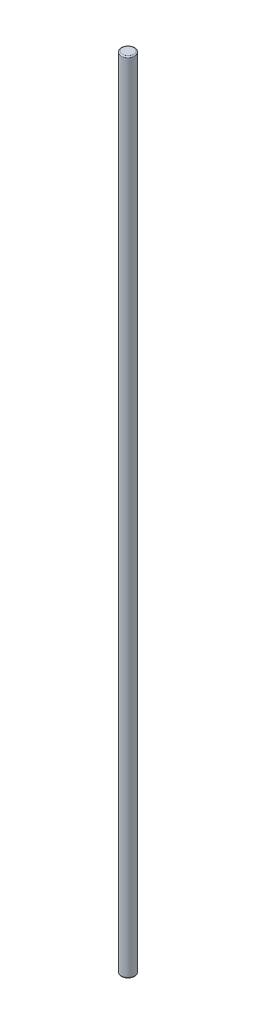
ISO-10303-21;
HEADER;
FILE_DESCRIPTION(('STEP AP214'),'2;1');
FILE_NAME('part.step','',(''),(''),'','','');
FILE_SCHEMA(('AUTOMOTIVE_DESIGN { 1 0 10303 214 1 1 1 1 }'));
ENDSEC;
DATA;
#1=APPLICATION_CONTEXT('core data for automotive mechanical design processes');
#2=APPLICATION_PROTOCOL_DEFINITION('international standard','automotive_design',2000,#1);
#3=PRODUCT_CONTEXT('',#1,'mechanical');
#4=PRODUCT('Part','Part','',(#3));
#5=PRODUCT_RELATED_PRODUCT_CATEGORY('part','',(#4));
#6=PRODUCT_DEFINITION_FORMATION('','',#4);
#7=PRODUCT_DEFINITION_CONTEXT('part definition',#1,'design');
#8=PRODUCT_DEFINITION('design','',#6,#7);
#9=PRODUCT_DEFINITION_SHAPE('','',#8);
#10=(LENGTH_UNIT() NAMED_UNIT(*) SI_UNIT(.MILLI.,.METRE.));
#11=(NAMED_UNIT(*) PLANE_ANGLE_UNIT() SI_UNIT($,.RADIAN.));
#12=(NAMED_UNIT(*) SI_UNIT($,.STERADIAN.) SOLID_ANGLE_UNIT());
#13=UNCERTAINTY_MEASURE_WITH_UNIT(LENGTH_MEASURE(1.E-05),#10,'distance_accuracy_value','');
#14=(GEOMETRIC_REPRESENTATION_CONTEXT(3) GLOBAL_UNCERTAINTY_ASSIGNED_CONTEXT((#13)) GLOBAL_UNIT_ASSIGNED_CONTEXT((#10,
#11,#12)) REPRESENTATION_CONTEXT('',''));
#15=CARTESIAN_POINT('',(0.,0.,0.));
#16=DIRECTION('',(0.,0.,1.));
#17=DIRECTION('',(1.,0.,0.));
#18=AXIS2_PLACEMENT_3D('',#15,#16,#17);
#19=CARTESIAN_POINT('',(0.,350.,0.));
#20=DIRECTION('',(0.,-1.,0.));
#21=DIRECTION('',(0.,0.,-1.));
#22=AXIS2_PLACEMENT_3D('',#19,#20,#21);
#23=CYLINDRICAL_SURFACE('',#22,3.);
#24=CARTESIAN_POINT('',(0.,349.5,0.));
#25=DIRECTION('',(0.,1.,0.));
#26=DIRECTION('',(0.,0.,1.));
#27=AXIS2_PLACEMENT_3D('',#24,#25,#26);
#28=CIRCLE('',#27,3.);
#29=CARTESIAN_POINT('',(0.,349.5,3.));
#30=VERTEX_POINT('',#29);
#31=EDGE_CURVE('E10',#30,#30,#28,.F.);
#32=ORIENTED_EDGE('',*,*,#31,.T.);
#33=EDGE_LOOP('',(#32));
#34=FACE_BOUND('',#33,.T.);
#35=CARTESIAN_POINT('',(0.,0.5,0.));
#36=DIRECTION('',(0.,1.,0.));
#37=DIRECTION('',(0.,0.,1.));
#38=AXIS2_PLACEMENT_3D('',#35,#36,#37);
#39=CIRCLE('',#38,3.);
#40=CARTESIAN_POINT('',(0.,0.5,3.));
#41=VERTEX_POINT('',#40);
#42=EDGE_CURVE('E51',#41,#41,#39,.T.);
#43=ORIENTED_EDGE('',*,*,#42,.T.);
#44=EDGE_LOOP('',(#43));
#45=FACE_BOUND('',#44,.T.);
#46=ADVANCED_FACE('F36',(#34,#45),#23,.T.);
#47=CARTESIAN_POINT('',(0.,350.,0.));
#48=DIRECTION('',(0.,1.,0.));
#49=DIRECTION('',(0.,0.,1.));
#50=AXIS2_PLACEMENT_3D('',#47,#48,#49);
#51=PLANE('',#50);
#52=CARTESIAN_POINT('',(0.,350.,0.));
#53=DIRECTION('',(0.,1.,0.));
#54=DIRECTION('',(0.,0.,1.));
#55=AXIS2_PLACEMENT_3D('',#52,#53,#54);
#56=CIRCLE('',#55,2.5);
#57=CARTESIAN_POINT('',(0.,350.,2.5));
#58=VERTEX_POINT('',#57);
#59=EDGE_CURVE('E43',#58,#58,#56,.T.);
#60=ORIENTED_EDGE('',*,*,#59,.T.);
#61=EDGE_LOOP('',(#60));
#62=FACE_BOUND('',#61,.T.);
#63=ADVANCED_FACE('F67',(#62),#51,.T.);
#64=CARTESIAN_POINT('',(0.,0.,0.));
#65=DIRECTION('',(0.,1.,0.));
#66=DIRECTION('',(0.,0.,1.));
#67=AXIS2_PLACEMENT_3D('',#64,#65,#66);
#68=PLANE('',#67);
#69=CARTESIAN_POINT('',(0.,0.,0.));
#70=DIRECTION('',(0.,1.,0.));
#71=DIRECTION('',(0.,0.,1.));
#72=AXIS2_PLACEMENT_3D('',#69,#70,#71);
#73=CIRCLE('',#72,2.5);
#74=CARTESIAN_POINT('',(0.,0.,2.5));
#75=VERTEX_POINT('',#74);
#76=EDGE_CURVE('E47',#75,#75,#73,.F.);
#77=ORIENTED_EDGE('',*,*,#76,.T.);
#78=EDGE_LOOP('',(#77));
#79=FACE_BOUND('',#78,.T.);
#80=ADVANCED_FACE('F60',(#79),#68,.F.);
#81=CARTESIAN_POINT('',(0.,0.5,0.));
#82=DIRECTION('',(0.,1.,0.));
#83=DIRECTION('',(0.,0.,1.));
#84=AXIS2_PLACEMENT_3D('',#81,#82,#83);
#85=TOROIDAL_SURFACE('',#84,2.5,0.5);
#86=ORIENTED_EDGE('',*,*,#76,.F.);
#87=EDGE_LOOP('',(#86));
#88=FACE_BOUND('',#87,.T.);
#89=ORIENTED_EDGE('',*,*,#42,.F.);
#90=EDGE_LOOP('',(#89));
#91=FACE_BOUND('',#90,.T.);
#92=ADVANCED_FACE('F58',(#88,#91),#85,.T.);
#93=CARTESIAN_POINT('',(0.,349.5,0.));
#94=DIRECTION('',(0.,1.,0.));
#95=DIRECTION('',(0.,0.,1.));
#96=AXIS2_PLACEMENT_3D('',#93,#94,#95);
#97=TOROIDAL_SURFACE('',#96,2.5,0.5);
#98=ORIENTED_EDGE('',*,*,#31,.F.);
#99=EDGE_LOOP('',(#98));
#100=FACE_BOUND('',#99,.T.);
#101=ORIENTED_EDGE('',*,*,#59,.F.);
#102=EDGE_LOOP('',(#101));
#103=FACE_BOUND('',#102,.T.);
#104=ADVANCED_FACE('F38',(#100,#103),#97,.T.);
#105=CLOSED_SHELL('',(#46,#63,#80,#92,#104));
#106=MANIFOLD_SOLID_BREP('B2',#105);
#107=ADVANCED_BREP_SHAPE_REPRESENTATION('',(#18,#106),#14);
#108=SHAPE_DEFINITION_REPRESENTATION(#9,#107);
ENDSEC;
END-ISO-10303-21;
